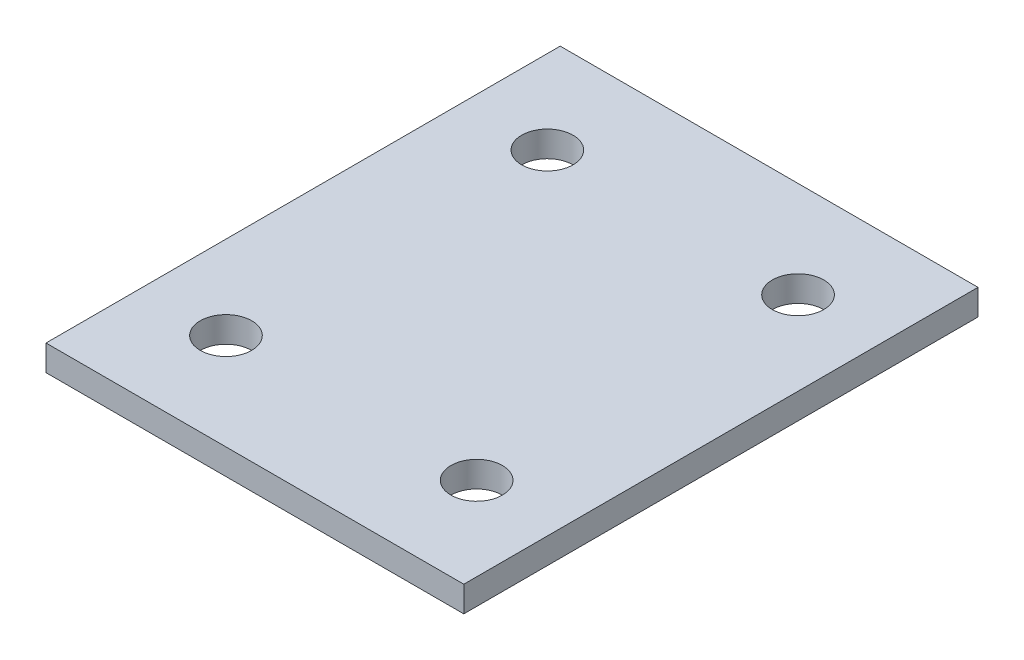
ISO-10303-21;
HEADER;
FILE_DESCRIPTION(('STEP AP214'),'2;1');
FILE_NAME('part.step','',(''),(''),'','','');
FILE_SCHEMA(('AUTOMOTIVE_DESIGN { 1 0 10303 214 1 1 1 1 }'));
ENDSEC;
DATA;
#1=APPLICATION_CONTEXT('core data for automotive mechanical design processes');
#2=APPLICATION_PROTOCOL_DEFINITION('international standard','automotive_design',2000,#1);
#3=PRODUCT_CONTEXT('',#1,'mechanical');
#4=PRODUCT('Part','Part','',(#3));
#5=PRODUCT_RELATED_PRODUCT_CATEGORY('part','',(#4));
#6=PRODUCT_DEFINITION_FORMATION('','',#4);
#7=PRODUCT_DEFINITION_CONTEXT('part definition',#1,'design');
#8=PRODUCT_DEFINITION('design','',#6,#7);
#9=PRODUCT_DEFINITION_SHAPE('','',#8);
#10=(LENGTH_UNIT() NAMED_UNIT(*) SI_UNIT(.MILLI.,.METRE.));
#11=(NAMED_UNIT(*) PLANE_ANGLE_UNIT() SI_UNIT($,.RADIAN.));
#12=(NAMED_UNIT(*) SI_UNIT($,.STERADIAN.) SOLID_ANGLE_UNIT());
#13=UNCERTAINTY_MEASURE_WITH_UNIT(LENGTH_MEASURE(1.E-05),#10,'distance_accuracy_value','');
#14=(GEOMETRIC_REPRESENTATION_CONTEXT(3) GLOBAL_UNCERTAINTY_ASSIGNED_CONTEXT((#13)) GLOBAL_UNIT_ASSIGNED_CONTEXT((#10,
#11,#12)) REPRESENTATION_CONTEXT('',''));
#15=CARTESIAN_POINT('',(0.,0.,0.));
#16=DIRECTION('',(0.,0.,1.));
#17=DIRECTION('',(1.,0.,0.));
#18=AXIS2_PLACEMENT_3D('',#15,#16,#17);
#19=CARTESIAN_POINT('',(0.,4.,-80.));
#20=DIRECTION('',(0.,-1.,0.));
#21=DIRECTION('',(0.,0.,-1.));
#22=AXIS2_PLACEMENT_3D('',#19,#20,#21);
#23=PLANE('',#22);
#24=CARTESIAN_POINT('',(52.,4.,-15.));
#25=DIRECTION('',(0.,1.,0.));
#26=DIRECTION('',(0.,0.,1.));
#27=AXIS2_PLACEMENT_3D('',#24,#25,#26);
#28=CIRCLE('',#27,4.00000000000001);
#29=CARTESIAN_POINT('',(52.,4.,-11.));
#30=VERTEX_POINT('',#29);
#31=EDGE_CURVE('E121',#30,#30,#28,.T.);
#32=ORIENTED_EDGE('',*,*,#31,.F.);
#33=EDGE_LOOP('',(#32));
#34=FACE_BOUND('',#33,.T.);
#35=CARTESIAN_POINT('',(13.,4.,-65.));
#36=DIRECTION('',(0.,1.,0.));
#37=DIRECTION('',(0.,0.,1.));
#38=AXIS2_PLACEMENT_3D('',#35,#36,#37);
#39=CIRCLE('',#38,4.00000000000001);
#40=CARTESIAN_POINT('',(13.,4.,-61.));
#41=VERTEX_POINT('',#40);
#42=EDGE_CURVE('E100',#41,#41,#39,.T.);
#43=ORIENTED_EDGE('',*,*,#42,.F.);
#44=EDGE_LOOP('',(#43));
#45=FACE_BOUND('',#44,.T.);
#46=DIRECTION('',(0.,0.,1.));
#47=VECTOR('',#46,1.);
#48=CARTESIAN_POINT('',(0.,4.,0.));
#49=LINE('',#48,#47);
#50=CARTESIAN_POINT('',(0.,4.,-80.));
#51=VERTEX_POINT('',#50);
#52=CARTESIAN_POINT('',(0.,4.,0.));
#53=VERTEX_POINT('',#52);
#54=EDGE_CURVE('E85',#51,#53,#49,.T.);
#55=ORIENTED_EDGE('',*,*,#54,.T.);
#56=DIRECTION('',(1.,0.,0.));
#57=VECTOR('',#56,1.);
#58=CARTESIAN_POINT('',(0.,4.,0.));
#59=LINE('',#58,#57);
#60=CARTESIAN_POINT('',(65.,4.,0.));
#61=VERTEX_POINT('',#60);
#62=EDGE_CURVE('E80',#53,#61,#59,.T.);
#63=ORIENTED_EDGE('',*,*,#62,.T.);
#64=DIRECTION('',(0.,0.,-1.));
#65=VECTOR('',#64,1.);
#66=CARTESIAN_POINT('',(65.,4.,0.));
#67=LINE('',#66,#65);
#68=CARTESIAN_POINT('',(65.,4.,-80.));
#69=VERTEX_POINT('',#68);
#70=EDGE_CURVE('E83',#61,#69,#67,.T.);
#71=ORIENTED_EDGE('',*,*,#70,.T.);
#72=DIRECTION('',(-1.,0.,0.));
#73=VECTOR('',#72,1.);
#74=CARTESIAN_POINT('',(0.,4.,-80.));
#75=LINE('',#74,#73);
#76=EDGE_CURVE('E50',#69,#51,#75,.T.);
#77=ORIENTED_EDGE('',*,*,#76,.T.);
#78=EDGE_LOOP('',(#55,#63,#71,#77));
#79=FACE_BOUND('',#78,.T.);
#80=CARTESIAN_POINT('',(13.,4.,-15.));
#81=DIRECTION('',(0.,1.,0.));
#82=DIRECTION('',(0.,0.,-1.));
#83=AXIS2_PLACEMENT_3D('',#80,#81,#82);
#84=CIRCLE('',#83,4.00000000000001);
#85=CARTESIAN_POINT('',(13.,4.,-19.));
#86=VERTEX_POINT('',#85);
#87=EDGE_CURVE('E115',#86,#86,#84,.T.);
#88=ORIENTED_EDGE('',*,*,#87,.F.);
#89=EDGE_LOOP('',(#88));
#90=FACE_BOUND('',#89,.T.);
#91=CARTESIAN_POINT('',(52.,4.,-65.));
#92=DIRECTION('',(0.,1.,0.));
#93=DIRECTION('',(0.,0.,-1.));
#94=AXIS2_PLACEMENT_3D('',#91,#92,#93);
#95=CIRCLE('',#94,4.00000000000001);
#96=CARTESIAN_POINT('',(52.,4.,-69.));
#97=VERTEX_POINT('',#96);
#98=EDGE_CURVE('E127',#97,#97,#95,.T.);
#99=ORIENTED_EDGE('',*,*,#98,.F.);
#100=EDGE_LOOP('',(#99));
#101=FACE_BOUND('',#100,.T.);
#102=ADVANCED_FACE('F33',(#34,#45,#79,#90,#101),#23,.F.);
#103=CARTESIAN_POINT('',(0.,0.,-80.));
#104=DIRECTION('',(0.,-1.,0.));
#105=DIRECTION('',(0.,0.,-1.));
#106=AXIS2_PLACEMENT_3D('',#103,#104,#105);
#107=PLANE('',#106);
#108=CARTESIAN_POINT('',(52.,0.,-15.));
#109=DIRECTION('',(0.,1.,0.));
#110=DIRECTION('',(0.,0.,1.));
#111=AXIS2_PLACEMENT_3D('',#108,#109,#110);
#112=CIRCLE('',#111,4.00000000000001);
#113=CARTESIAN_POINT('',(52.,0.,-11.));
#114=VERTEX_POINT('',#113);
#115=EDGE_CURVE('E124',#114,#114,#112,.T.);
#116=ORIENTED_EDGE('',*,*,#115,.T.);
#117=EDGE_LOOP('',(#116));
#118=FACE_BOUND('',#117,.T.);
#119=CARTESIAN_POINT('',(13.,0.,-65.));
#120=DIRECTION('',(0.,1.,0.));
#121=DIRECTION('',(0.,0.,1.));
#122=AXIS2_PLACEMENT_3D('',#119,#120,#121);
#123=CIRCLE('',#122,4.00000000000001);
#124=CARTESIAN_POINT('',(13.,0.,-61.));
#125=VERTEX_POINT('',#124);
#126=EDGE_CURVE('E112',#125,#125,#123,.T.);
#127=ORIENTED_EDGE('',*,*,#126,.T.);
#128=EDGE_LOOP('',(#127));
#129=FACE_BOUND('',#128,.T.);
#130=DIRECTION('',(0.,0.,1.));
#131=VECTOR('',#130,1.);
#132=CARTESIAN_POINT('',(0.,0.,0.));
#133=LINE('',#132,#131);
#134=CARTESIAN_POINT('',(0.,0.,-80.));
#135=VERTEX_POINT('',#134);
#136=CARTESIAN_POINT('',(0.,0.,0.));
#137=VERTEX_POINT('',#136);
#138=EDGE_CURVE('E97',#135,#137,#133,.T.);
#139=ORIENTED_EDGE('',*,*,#138,.F.);
#140=DIRECTION('',(-1.,0.,0.));
#141=VECTOR('',#140,1.);
#142=CARTESIAN_POINT('',(0.,0.,-80.));
#143=LINE('',#142,#141);
#144=CARTESIAN_POINT('',(65.,0.,-80.));
#145=VERTEX_POINT('',#144);
#146=EDGE_CURVE('E73',#145,#135,#143,.T.);
#147=ORIENTED_EDGE('',*,*,#146,.F.);
#148=DIRECTION('',(0.,0.,-1.));
#149=VECTOR('',#148,1.);
#150=CARTESIAN_POINT('',(65.,0.,0.));
#151=LINE('',#150,#149);
#152=CARTESIAN_POINT('',(65.,0.,0.));
#153=VERTEX_POINT('',#152);
#154=EDGE_CURVE('E67',#153,#145,#151,.T.);
#155=ORIENTED_EDGE('',*,*,#154,.F.);
#156=DIRECTION('',(1.,0.,0.));
#157=VECTOR('',#156,1.);
#158=CARTESIAN_POINT('',(0.,0.,0.));
#159=LINE('',#158,#157);
#160=EDGE_CURVE('E89',#137,#153,#159,.T.);
#161=ORIENTED_EDGE('',*,*,#160,.F.);
#162=EDGE_LOOP('',(#139,#147,#155,#161));
#163=FACE_BOUND('',#162,.T.);
#164=CARTESIAN_POINT('',(13.,0.,-15.));
#165=DIRECTION('',(0.,1.,0.));
#166=DIRECTION('',(0.,0.,-1.));
#167=AXIS2_PLACEMENT_3D('',#164,#165,#166);
#168=CIRCLE('',#167,4.00000000000001);
#169=CARTESIAN_POINT('',(13.,0.,-19.));
#170=VERTEX_POINT('',#169);
#171=EDGE_CURVE('E118',#170,#170,#168,.T.);
#172=ORIENTED_EDGE('',*,*,#171,.T.);
#173=EDGE_LOOP('',(#172));
#174=FACE_BOUND('',#173,.T.);
#175=CARTESIAN_POINT('',(52.,0.,-65.));
#176=DIRECTION('',(0.,1.,0.));
#177=DIRECTION('',(0.,0.,-1.));
#178=AXIS2_PLACEMENT_3D('',#175,#176,#177);
#179=CIRCLE('',#178,4.00000000000001);
#180=CARTESIAN_POINT('',(52.,0.,-69.));
#181=VERTEX_POINT('',#180);
#182=EDGE_CURVE('E130',#181,#181,#179,.T.);
#183=ORIENTED_EDGE('',*,*,#182,.T.);
#184=EDGE_LOOP('',(#183));
#185=FACE_BOUND('',#184,.T.);
#186=ADVANCED_FACE('F108',(#118,#129,#163,#174,#185),#107,.T.);
#187=CARTESIAN_POINT('',(0.,4.,0.));
#188=DIRECTION('',(1.,0.,0.));
#189=DIRECTION('',(0.,0.,-1.));
#190=AXIS2_PLACEMENT_3D('',#187,#188,#189);
#191=PLANE('',#190);
#192=ORIENTED_EDGE('',*,*,#138,.T.);
#193=DIRECTION('',(0.,-1.,0.));
#194=VECTOR('',#193,1.);
#195=CARTESIAN_POINT('',(0.,4.,0.));
#196=LINE('',#195,#194);
#197=EDGE_CURVE('E11',#53,#137,#196,.T.);
#198=ORIENTED_EDGE('',*,*,#197,.F.);
#199=ORIENTED_EDGE('',*,*,#54,.F.);
#200=DIRECTION('',(0.,-1.,0.));
#201=VECTOR('',#200,1.);
#202=CARTESIAN_POINT('',(0.,4.,-80.));
#203=LINE('',#202,#201);
#204=EDGE_CURVE('E93',#51,#135,#203,.T.);
#205=ORIENTED_EDGE('',*,*,#204,.T.);
#206=EDGE_LOOP('',(#192,#198,#199,#205));
#207=FACE_BOUND('',#206,.T.);
#208=ADVANCED_FACE('F35',(#207),#191,.F.);
#209=CARTESIAN_POINT('',(0.,4.,0.));
#210=DIRECTION('',(0.,0.,-1.));
#211=DIRECTION('',(-1.,0.,0.));
#212=AXIS2_PLACEMENT_3D('',#209,#210,#211);
#213=PLANE('',#212);
#214=ORIENTED_EDGE('',*,*,#160,.T.);
#215=DIRECTION('',(0.,-1.,0.));
#216=VECTOR('',#215,1.);
#217=CARTESIAN_POINT('',(65.,4.,0.));
#218=LINE('',#217,#216);
#219=EDGE_CURVE('E42',#61,#153,#218,.T.);
#220=ORIENTED_EDGE('',*,*,#219,.F.);
#221=ORIENTED_EDGE('',*,*,#62,.F.);
#222=ORIENTED_EDGE('',*,*,#197,.T.);
#223=EDGE_LOOP('',(#214,#220,#221,#222));
#224=FACE_BOUND('',#223,.T.);
#225=ADVANCED_FACE('F88',(#224),#213,.F.);
#226=CARTESIAN_POINT('',(65.,4.,0.));
#227=DIRECTION('',(-1.,0.,0.));
#228=DIRECTION('',(0.,0.,1.));
#229=AXIS2_PLACEMENT_3D('',#226,#227,#228);
#230=PLANE('',#229);
#231=ORIENTED_EDGE('',*,*,#154,.T.);
#232=DIRECTION('',(0.,-1.,0.));
#233=VECTOR('',#232,1.);
#234=CARTESIAN_POINT('',(65.,4.,-80.));
#235=LINE('',#234,#233);
#236=EDGE_CURVE('E90',#69,#145,#235,.T.);
#237=ORIENTED_EDGE('',*,*,#236,.F.);
#238=ORIENTED_EDGE('',*,*,#70,.F.);
#239=ORIENTED_EDGE('',*,*,#219,.T.);
#240=EDGE_LOOP('',(#231,#237,#238,#239));
#241=FACE_BOUND('',#240,.T.);
#242=ADVANCED_FACE('F91',(#241),#230,.F.);
#243=CARTESIAN_POINT('',(0.,4.,-80.));
#244=DIRECTION('',(0.,0.,1.));
#245=DIRECTION('',(1.,0.,0.));
#246=AXIS2_PLACEMENT_3D('',#243,#244,#245);
#247=PLANE('',#246);
#248=ORIENTED_EDGE('',*,*,#146,.T.);
#249=ORIENTED_EDGE('',*,*,#204,.F.);
#250=ORIENTED_EDGE('',*,*,#76,.F.);
#251=ORIENTED_EDGE('',*,*,#236,.T.);
#252=EDGE_LOOP('',(#248,#249,#250,#251));
#253=FACE_BOUND('',#252,.T.);
#254=ADVANCED_FACE('F105',(#253),#247,.F.);
#255=CARTESIAN_POINT('',(13.,4.,-65.));
#256=DIRECTION('',(0.,-1.,0.));
#257=DIRECTION('',(0.,0.,-1.));
#258=AXIS2_PLACEMENT_3D('',#255,#256,#257);
#259=CYLINDRICAL_SURFACE('',#258,4.00000000000001);
#260=ORIENTED_EDGE('',*,*,#42,.T.);
#261=EDGE_LOOP('',(#260));
#262=FACE_BOUND('',#261,.T.);
#263=ORIENTED_EDGE('',*,*,#126,.F.);
#264=EDGE_LOOP('',(#263));
#265=FACE_BOUND('',#264,.T.);
#266=ADVANCED_FACE('F150',(#262,#265),#259,.F.);
#267=CARTESIAN_POINT('',(13.,4.,-15.));
#268=DIRECTION('',(0.,-1.,0.));
#269=DIRECTION('',(0.,0.,-1.));
#270=AXIS2_PLACEMENT_3D('',#267,#268,#269);
#271=CYLINDRICAL_SURFACE('',#270,4.00000000000001);
#272=ORIENTED_EDGE('',*,*,#87,.T.);
#273=EDGE_LOOP('',(#272));
#274=FACE_BOUND('',#273,.T.);
#275=ORIENTED_EDGE('',*,*,#171,.F.);
#276=EDGE_LOOP('',(#275));
#277=FACE_BOUND('',#276,.T.);
#278=ADVANCED_FACE('F196',(#274,#277),#271,.F.);
#279=CARTESIAN_POINT('',(52.,4.,-15.));
#280=DIRECTION('',(0.,-1.,0.));
#281=DIRECTION('',(0.,0.,-1.));
#282=AXIS2_PLACEMENT_3D('',#279,#280,#281);
#283=CYLINDRICAL_SURFACE('',#282,4.00000000000001);
#284=ORIENTED_EDGE('',*,*,#31,.T.);
#285=EDGE_LOOP('',(#284));
#286=FACE_BOUND('',#285,.T.);
#287=ORIENTED_EDGE('',*,*,#115,.F.);
#288=EDGE_LOOP('',(#287));
#289=FACE_BOUND('',#288,.T.);
#290=ADVANCED_FACE('F204',(#286,#289),#283,.F.);
#291=CARTESIAN_POINT('',(52.,4.,-65.));
#292=DIRECTION('',(0.,-1.,0.));
#293=DIRECTION('',(0.,0.,-1.));
#294=AXIS2_PLACEMENT_3D('',#291,#292,#293);
#295=CYLINDRICAL_SURFACE('',#294,4.00000000000001);
#296=ORIENTED_EDGE('',*,*,#98,.T.);
#297=EDGE_LOOP('',(#296));
#298=FACE_BOUND('',#297,.T.);
#299=ORIENTED_EDGE('',*,*,#182,.F.);
#300=EDGE_LOOP('',(#299));
#301=FACE_BOUND('',#300,.T.);
#302=ADVANCED_FACE('F136',(#298,#301),#295,.F.);
#303=CLOSED_SHELL('',(#102,#186,#208,#225,#242,#254,#266,#278,#290,#302));
#304=MANIFOLD_SOLID_BREP('B2',#303);
#305=ADVANCED_BREP_SHAPE_REPRESENTATION('',(#18,#304),#14);
#306=SHAPE_DEFINITION_REPRESENTATION(#9,#305);
ENDSEC;
END-ISO-10303-21;
